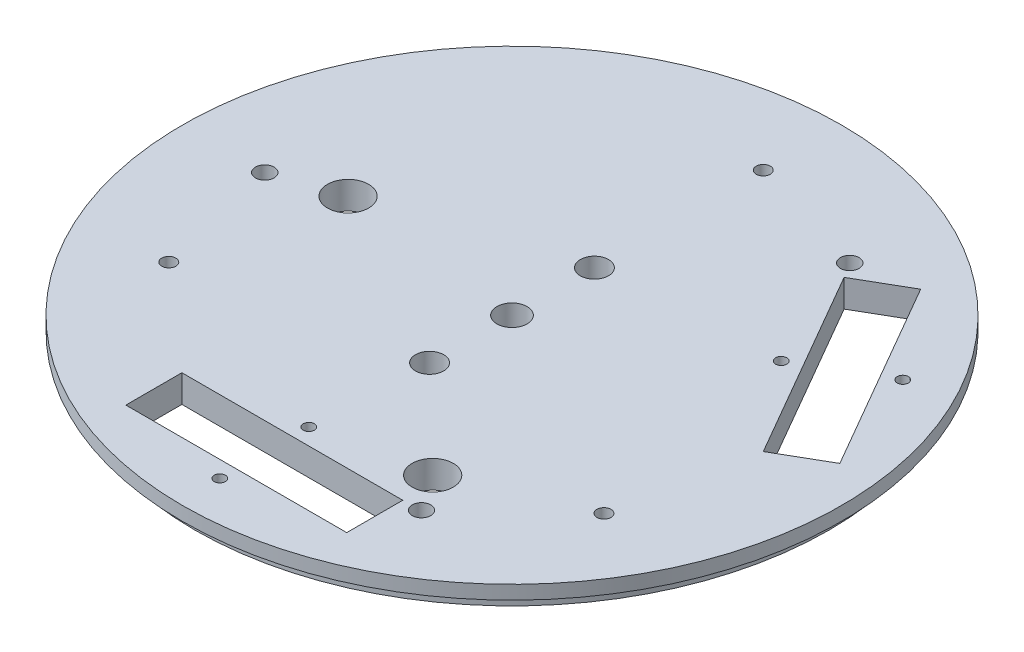
ISO-10303-21;
HEADER;
FILE_DESCRIPTION(('STEP AP214'),'2;1');
FILE_NAME('part.step','',(''),(''),'','','');
FILE_SCHEMA(('AUTOMOTIVE_DESIGN { 1 0 10303 214 1 1 1 1 }'));
ENDSEC;
DATA;
#1=APPLICATION_CONTEXT('core data for automotive mechanical design processes');
#2=APPLICATION_PROTOCOL_DEFINITION('international standard','automotive_design',2000,#1);
#3=PRODUCT_CONTEXT('',#1,'mechanical');
#4=PRODUCT('Part','Part','',(#3));
#5=PRODUCT_RELATED_PRODUCT_CATEGORY('part','',(#4));
#6=PRODUCT_DEFINITION_FORMATION('','',#4);
#7=PRODUCT_DEFINITION_CONTEXT('part definition',#1,'design');
#8=PRODUCT_DEFINITION('design','',#6,#7);
#9=PRODUCT_DEFINITION_SHAPE('','',#8);
#10=(LENGTH_UNIT() NAMED_UNIT(*) SI_UNIT(.MILLI.,.METRE.));
#11=(NAMED_UNIT(*) PLANE_ANGLE_UNIT() SI_UNIT($,.RADIAN.));
#12=(NAMED_UNIT(*) SI_UNIT($,.STERADIAN.) SOLID_ANGLE_UNIT());
#13=UNCERTAINTY_MEASURE_WITH_UNIT(LENGTH_MEASURE(1.E-05),#10,'distance_accuracy_value','');
#14=(GEOMETRIC_REPRESENTATION_CONTEXT(3) GLOBAL_UNCERTAINTY_ASSIGNED_CONTEXT((#13)) GLOBAL_UNIT_ASSIGNED_CONTEXT((#10,
#11,#12)) REPRESENTATION_CONTEXT('',''));
#15=CARTESIAN_POINT('',(0.,0.,0.));
#16=DIRECTION('',(0.,0.,1.));
#17=DIRECTION('',(1.,0.,0.));
#18=AXIS2_PLACEMENT_3D('',#15,#16,#17);
#19=CARTESIAN_POINT('',(0.,-3.175,0.));
#20=DIRECTION('',(0.,1.,0.));
#21=DIRECTION('',(0.,0.,1.));
#22=AXIS2_PLACEMENT_3D('',#19,#20,#21);
#23=CYLINDRICAL_SURFACE('',#22,76.1746);
#24=CARTESIAN_POINT('',(0.,-3.175,0.));
#25=DIRECTION('',(0.,1.,0.));
#26=DIRECTION('',(0.,0.,1.));
#27=AXIS2_PLACEMENT_3D('',#24,#25,#26);
#28=CIRCLE('',#27,76.1746);
#29=CARTESIAN_POINT('',(0.,-3.175,76.1746));
#30=VERTEX_POINT('',#29);
#31=EDGE_CURVE('E50',#30,#30,#28,.T.);
#32=ORIENTED_EDGE('',*,*,#31,.T.);
#33=EDGE_LOOP('',(#32));
#34=FACE_BOUND('',#33,.T.);
#35=CARTESIAN_POINT('',(0.,0.,0.));
#36=DIRECTION('',(0.,1.,0.));
#37=DIRECTION('',(0.,0.,1.));
#38=AXIS2_PLACEMENT_3D('',#35,#36,#37);
#39=CIRCLE('',#38,76.1746);
#40=CARTESIAN_POINT('',(0.,0.,76.1746));
#41=VERTEX_POINT('',#40);
#42=EDGE_CURVE('E262',#41,#41,#39,.T.);
#43=ORIENTED_EDGE('',*,*,#42,.F.);
#44=EDGE_LOOP('',(#43));
#45=FACE_BOUND('',#44,.T.);
#46=ADVANCED_FACE('F41',(#34,#45),#23,.T.);
#47=CARTESIAN_POINT('',(0.,-3.175,0.));
#48=DIRECTION('',(0.,1.,0.));
#49=DIRECTION('',(0.,0.,1.));
#50=AXIS2_PLACEMENT_3D('',#47,#48,#49);
#51=PLANE('',#50);
#52=CARTESIAN_POINT('',(0.,-3.175,0.));
#53=DIRECTION('',(0.,-1.,0.));
#54=DIRECTION('',(0.,0.,-1.));
#55=AXIS2_PLACEMENT_3D('',#52,#53,#54);
#56=CIRCLE('',#55,73.3171);
#57=CARTESIAN_POINT('',(0.,-3.175,-73.3171));
#58=VERTEX_POINT('',#57);
#59=EDGE_CURVE('E11',#58,#58,#56,.T.);
#60=ORIENTED_EDGE('',*,*,#59,.F.);
#61=EDGE_LOOP('',(#60));
#62=FACE_BOUND('',#61,.T.);
#63=ORIENTED_EDGE('',*,*,#31,.F.);
#64=EDGE_LOOP('',(#63));
#65=FACE_BOUND('',#64,.T.);
#66=ADVANCED_FACE('F291',(#62,#65),#51,.F.);
#67=CARTESIAN_POINT('',(0.,0.,0.));
#68=DIRECTION('',(0.,1.,0.));
#69=DIRECTION('',(0.,0.,1.));
#70=AXIS2_PLACEMENT_3D('',#67,#68,#69);
#71=PLANE('',#70);
#72=CARTESIAN_POINT('',(40.2634666873046,0.,-21.9556300087316));
#73=DIRECTION('',(0.,1.,0.));
#74=DIRECTION('',(-0.866025403784436,0.,0.500000000000004));
#75=AXIS2_PLACEMENT_3D('',#72,#73,#74);
#76=CIRCLE('',#75,1.29203120481089);
#77=CARTESIAN_POINT('',(39.1445348414561,0.,-21.3096144063262));
#78=VERTEX_POINT('',#77);
#79=EDGE_CURVE('E134',#78,#78,#76,.T.);
#80=ORIENTED_EDGE('',*,*,#79,.F.);
#81=EDGE_LOOP('',(#80));
#82=FACE_BOUND('',#81,.T.);
#83=CARTESIAN_POINT('',(58.081073344766,0.,-32.2426300087309));
#84=DIRECTION('',(0.,1.,0.));
#85=DIRECTION('',(0.866025403784436,0.,-0.500000000000004));
#86=AXIS2_PLACEMENT_3D('',#83,#84,#85);
#87=CIRCLE('',#86,1.2920312048119);
#88=CARTESIAN_POINT('',(59.2000051906153,0.,-32.8886456111368));
#89=VERTEX_POINT('',#88);
#90=EDGE_CURVE('E398',#89,#89,#87,.T.);
#91=ORIENTED_EDGE('',*,*,#90,.F.);
#92=EDGE_LOOP('',(#91));
#93=FACE_BOUND('',#92,.T.);
#94=DIRECTION('',(0.866025403784433,0.,-0.50000000000001));
#95=VECTOR('',#94,1.);
#96=CARTESIAN_POINT('',(56.326523475724,0.,-1.75359952632551));
#97=LINE('',#96,#95);
#98=CARTESIAN_POINT('',(56.326523475724,0.,-1.75359952632551));
#99=VERTEX_POINT('',#98);
#100=CARTESIAN_POINT('',(67.5450165563476,0.,-8.23059952632564));
#101=VERTEX_POINT('',#100);
#102=EDGE_CURVE('E58',#99,#101,#97,.T.);
#103=ORIENTED_EDGE('',*,*,#102,.F.);
#104=DIRECTION('',(0.50000000000001,0.,0.866025403784433));
#105=VECTOR('',#104,1.);
#106=CARTESIAN_POINT('',(56.326523475724,0.,-1.75359952632551));
#107=LINE('',#106,#105);
#108=CARTESIAN_POINT('',(30.7995234757235,0.,-45.9676604911359));
#109=VERTEX_POINT('',#108);
#110=EDGE_CURVE('E127',#109,#99,#107,.T.);
#111=ORIENTED_EDGE('',*,*,#110,.F.);
#112=DIRECTION('',(-0.866025403784433,0.,0.50000000000001));
#113=VECTOR('',#112,1.);
#114=CARTESIAN_POINT('',(30.7995234757235,0.,-45.9676604911359));
#115=LINE('',#114,#113);
#116=CARTESIAN_POINT('',(42.0180165563471,0.,-52.4446604911361));
#117=VERTEX_POINT('',#116);
#118=EDGE_CURVE('E131',#117,#109,#115,.T.);
#119=ORIENTED_EDGE('',*,*,#118,.F.);
#120=DIRECTION('',(-0.50000000000001,0.,-0.866025403784433));
#121=VECTOR('',#120,1.);
#122=CARTESIAN_POINT('',(67.5450165563476,0.,-8.23059952632564));
#123=LINE('',#122,#121);
#124=EDGE_CURVE('E141',#101,#117,#123,.T.);
#125=ORIENTED_EDGE('',*,*,#124,.F.);
#126=EDGE_LOOP('',(#103,#111,#119,#125));
#127=FACE_BOUND('',#126,.T.);
#128=CARTESIAN_POINT('',(50.2940442736039,0.,29.0372799999995));
#129=DIRECTION('',(0.,1.,0.));
#130=DIRECTION('',(0.,0.,1.));
#131=AXIS2_PLACEMENT_3D('',#128,#129,#130);
#132=CIRCLE('',#131,1.63195);
#133=CARTESIAN_POINT('',(50.2940442736039,0.,30.6692299999995));
#134=VERTEX_POINT('',#133);
#135=EDGE_CURVE('E149',#134,#134,#132,.T.);
#136=ORIENTED_EDGE('',*,*,#135,.F.);
#137=EDGE_LOOP('',(#136));
#138=FACE_BOUND('',#137,.T.);
#139=CARTESIAN_POINT('',(-50.2940442736035,0.,29.0372800000003));
#140=DIRECTION('',(0.,1.,0.));
#141=DIRECTION('',(0.,0.,1.));
#142=AXIS2_PLACEMENT_3D('',#139,#140,#141);
#143=CIRCLE('',#142,1.63195);
#144=CARTESIAN_POINT('',(-50.2940442736035,0.,30.6692300000003));
#145=VERTEX_POINT('',#144);
#146=EDGE_CURVE('E158',#145,#145,#143,.T.);
#147=ORIENTED_EDGE('',*,*,#146,.F.);
#148=EDGE_LOOP('',(#147));
#149=FACE_BOUND('',#148,.T.);
#150=CARTESIAN_POINT('',(0.,0.,-58.07456));
#151=DIRECTION('',(0.,1.,0.));
#152=DIRECTION('',(0.,0.,1.));
#153=AXIS2_PLACEMENT_3D('',#150,#151,#152);
#154=CIRCLE('',#153,1.63195);
#155=CARTESIAN_POINT('',(0.,0.,-56.44261));
#156=VERTEX_POINT('',#155);
#157=EDGE_CURVE('E164',#156,#156,#154,.T.);
#158=ORIENTED_EDGE('',*,*,#157,.F.);
#159=EDGE_LOOP('',(#158));
#160=FACE_BOUND('',#159,.T.);
#161=CARTESIAN_POINT('',(-42.7800008,0.,-4.89000038));
#162=DIRECTION('',(0.,1.,0.));
#163=DIRECTION('',(0.,0.,1.));
#164=AXIS2_PLACEMENT_3D('',#161,#162,#163);
#165=CIRCLE('',#164,4.7625);
#166=CARTESIAN_POINT('',(-42.7800008,0.,-0.127500379999995));
#167=VERTEX_POINT('',#166);
#168=EDGE_CURVE('E171',#167,#167,#165,.T.);
#169=ORIENTED_EDGE('',*,*,#168,.F.);
#170=EDGE_LOOP('',(#169));
#171=FACE_BOUND('',#170,.T.);
#172=CARTESIAN_POINT('',(22.86,0.,41.1899989));
#173=DIRECTION('',(0.,1.,0.));
#174=DIRECTION('',(0.,0.,1.));
#175=AXIS2_PLACEMENT_3D('',#172,#173,#174);
#176=CIRCLE('',#175,4.7625);
#177=CARTESIAN_POINT('',(22.86,0.,45.9524989));
#178=VERTEX_POINT('',#177);
#179=EDGE_CURVE('E170',#178,#178,#176,.T.);
#180=ORIENTED_EDGE('',*,*,#179,.F.);
#181=EDGE_LOOP('',(#180));
#182=FACE_BOUND('',#181,.T.);
#183=CARTESIAN_POINT('',(28.5749999999999,0.,49.4933518262807));
#184=DIRECTION('',(0.,1.,0.));
#185=DIRECTION('',(0.,0.,1.));
#186=AXIS2_PLACEMENT_3D('',#183,#184,#185);
#187=CIRCLE('',#186,2.159);
#188=CARTESIAN_POINT('',(28.5749999999999,0.,51.6523518262807));
#189=VERTEX_POINT('',#188);
#190=EDGE_CURVE('E192',#189,#189,#187,.T.);
#191=ORIENTED_EDGE('',*,*,#190,.F.);
#192=EDGE_LOOP('',(#191));
#193=FACE_BOUND('',#192,.T.);
#194=CARTESIAN_POINT('',(-57.15,0.,-3.78169717762944E-13));
#195=DIRECTION('',(0.,1.,0.));
#196=DIRECTION('',(0.,0.,1.));
#197=AXIS2_PLACEMENT_3D('',#194,#195,#196);
#198=CIRCLE('',#197,2.159);
#199=CARTESIAN_POINT('',(-57.15,0.,2.15899999999962));
#200=VERTEX_POINT('',#199);
#201=EDGE_CURVE('E187',#200,#200,#198,.T.);
#202=ORIENTED_EDGE('',*,*,#201,.F.);
#203=EDGE_LOOP('',(#202));
#204=FACE_BOUND('',#203,.T.);
#205=CARTESIAN_POINT('',(28.5749999999999,0.,-49.4933518262808));
#206=DIRECTION('',(0.,1.,0.));
#207=DIRECTION('',(0.,0.,1.));
#208=AXIS2_PLACEMENT_3D('',#205,#206,#207);
#209=CIRCLE('',#208,2.159);
#210=CARTESIAN_POINT('',(28.5749999999999,0.,-47.3343518262808));
#211=VERTEX_POINT('',#210);
#212=EDGE_CURVE('E199',#211,#211,#209,.T.);
#213=ORIENTED_EDGE('',*,*,#212,.F.);
#214=EDGE_LOOP('',(#213));
#215=FACE_BOUND('',#214,.T.);
#216=CARTESIAN_POINT('',(-1.11759999999898,0.,45.847));
#217=DIRECTION('',(0.,1.,0.));
#218=DIRECTION('',(0.,0.,-1.));
#219=AXIS2_PLACEMENT_3D('',#216,#217,#218);
#220=CIRCLE('',#219,1.29203120481089);
#221=CARTESIAN_POINT('',(-1.11759999999898,0.,44.5549687951891));
#222=VERTEX_POINT('',#221);
#223=EDGE_CURVE('E202',#222,#222,#220,.T.);
#224=ORIENTED_EDGE('',*,*,#223,.F.);
#225=EDGE_LOOP('',(#224));
#226=FACE_BOUND('',#225,.T.);
#227=CARTESIAN_POINT('',(-1.11759999999988,0.,66.421));
#228=DIRECTION('',(0.,1.,0.));
#229=DIRECTION('',(0.,0.,1.));
#230=AXIS2_PLACEMENT_3D('',#227,#228,#229);
#231=CIRCLE('',#230,1.2920312048119);
#232=CARTESIAN_POINT('',(-1.11759999999988,0.,67.7130312048119));
#233=VERTEX_POINT('',#232);
#234=EDGE_CURVE('E207',#233,#233,#231,.T.);
#235=ORIENTED_EDGE('',*,*,#234,.F.);
#236=EDGE_LOOP('',(#235));
#237=FACE_BOUND('',#236,.T.);
#238=DIRECTION('',(0.,0.,1.));
#239=VECTOR('',#238,1.);
#240=CARTESIAN_POINT('',(-26.6446,0.,49.6570000000002));
#241=LINE('',#240,#239);
#242=CARTESIAN_POINT('',(-26.6446,0.,49.6570000000002));
#243=VERTEX_POINT('',#242);
#244=CARTESIAN_POINT('',(-26.6445999999999,0.,62.6110000000002));
#245=VERTEX_POINT('',#244);
#246=EDGE_CURVE('E206',#243,#245,#241,.T.);
#247=ORIENTED_EDGE('',*,*,#246,.F.);
#248=DIRECTION('',(-1.,0.,0.));
#249=VECTOR('',#248,1.);
#250=CARTESIAN_POINT('',(-26.6446,0.,49.6570000000002));
#251=LINE('',#250,#249);
#252=CARTESIAN_POINT('',(24.4094,0.,49.6569999999998));
#253=VERTEX_POINT('',#252);
#254=EDGE_CURVE('E219',#253,#243,#251,.T.);
#255=ORIENTED_EDGE('',*,*,#254,.F.);
#256=DIRECTION('',(0.,0.,-1.));
#257=VECTOR('',#256,1.);
#258=CARTESIAN_POINT('',(24.4094,0.,49.6569999999998));
#259=LINE('',#258,#257);
#260=CARTESIAN_POINT('',(24.4094000000001,0.,62.6109999999998));
#261=VERTEX_POINT('',#260);
#262=EDGE_CURVE('E233',#261,#253,#259,.T.);
#263=ORIENTED_EDGE('',*,*,#262,.F.);
#264=DIRECTION('',(1.,0.,0.));
#265=VECTOR('',#264,1.);
#266=CARTESIAN_POINT('',(-26.6445999999999,0.,62.6110000000002));
#267=LINE('',#266,#265);
#268=EDGE_CURVE('E230',#245,#261,#267,.T.);
#269=ORIENTED_EDGE('',*,*,#268,.F.);
#270=EDGE_LOOP('',(#247,#255,#263,#269));
#271=FACE_BOUND('',#270,.T.);
#272=CARTESIAN_POINT('',(0.,0.,19.05));
#273=DIRECTION('',(0.,1.,0.));
#274=DIRECTION('',(0.,0.,1.));
#275=AXIS2_PLACEMENT_3D('',#272,#273,#274);
#276=CIRCLE('',#275,3.2639);
#277=CARTESIAN_POINT('',(0.,0.,22.3139));
#278=VERTEX_POINT('',#277);
#279=EDGE_CURVE('E240',#278,#278,#276,.T.);
#280=ORIENTED_EDGE('',*,*,#279,.F.);
#281=EDGE_LOOP('',(#280));
#282=FACE_BOUND('',#281,.T.);
#283=CARTESIAN_POINT('',(0.,0.,-19.05));
#284=DIRECTION('',(0.,1.,0.));
#285=DIRECTION('',(0.,0.,1.));
#286=AXIS2_PLACEMENT_3D('',#283,#284,#285);
#287=CIRCLE('',#286,3.2639);
#288=CARTESIAN_POINT('',(0.,0.,-15.7861));
#289=VERTEX_POINT('',#288);
#290=EDGE_CURVE('E249',#289,#289,#287,.T.);
#291=ORIENTED_EDGE('',*,*,#290,.F.);
#292=EDGE_LOOP('',(#291));
#293=FACE_BOUND('',#292,.T.);
#294=CARTESIAN_POINT('',(0.,0.,0.));
#295=DIRECTION('',(0.,1.,0.));
#296=DIRECTION('',(0.,0.,1.));
#297=AXIS2_PLACEMENT_3D('',#294,#295,#296);
#298=CIRCLE('',#297,3.4925);
#299=CARTESIAN_POINT('',(0.,0.,3.4925));
#300=VERTEX_POINT('',#299);
#301=EDGE_CURVE('E256',#300,#300,#298,.T.);
#302=ORIENTED_EDGE('',*,*,#301,.F.);
#303=EDGE_LOOP('',(#302));
#304=FACE_BOUND('',#303,.T.);
#305=ORIENTED_EDGE('',*,*,#42,.T.);
#306=EDGE_LOOP('',(#305));
#307=FACE_BOUND('',#306,.T.);
#308=ADVANCED_FACE('F287',(#82,#93,#127,#138,#149,#160,#171,#182,#193,#204,#215,#226,#237,#271,
#282,#293,#304,#307),#71,.T.);
#309=CARTESIAN_POINT('',(0.,-6.35,0.));
#310=DIRECTION('',(0.,1.,0.));
#311=DIRECTION('',(0.,0.,1.));
#312=AXIS2_PLACEMENT_3D('',#309,#310,#311);
#313=CYLINDRICAL_SURFACE('',#312,73.3171);
#314=CARTESIAN_POINT('',(0.,-6.35,0.));
#315=DIRECTION('',(0.,-1.,0.));
#316=DIRECTION('',(0.,0.,-1.));
#317=AXIS2_PLACEMENT_3D('',#314,#315,#316);
#318=CIRCLE('',#317,73.3171);
#319=CARTESIAN_POINT('',(0.,-6.35,-73.3171));
#320=VERTEX_POINT('',#319);
#321=EDGE_CURVE('E259',#320,#320,#318,.T.);
#322=ORIENTED_EDGE('',*,*,#321,.F.);
#323=EDGE_LOOP('',(#322));
#324=FACE_BOUND('',#323,.T.);
#325=ORIENTED_EDGE('',*,*,#59,.T.);
#326=EDGE_LOOP('',(#325));
#327=FACE_BOUND('',#326,.T.);
#328=ADVANCED_FACE('F278',(#324,#327),#313,.T.);
#329=CARTESIAN_POINT('',(0.,-6.35,0.));
#330=DIRECTION('',(0.,-1.,0.));
#331=DIRECTION('',(0.,0.,-1.));
#332=AXIS2_PLACEMENT_3D('',#329,#330,#331);
#333=PLANE('',#332);
#334=CARTESIAN_POINT('',(40.2634666873046,-6.35,-21.9556300087316));
#335=DIRECTION('',(0.,1.,0.));
#336=DIRECTION('',(-0.866025403784436,0.,0.500000000000004));
#337=AXIS2_PLACEMENT_3D('',#334,#335,#336);
#338=CIRCLE('',#337,1.29203120481089);
#339=CARTESIAN_POINT('',(39.1445348414561,-6.35,-21.3096144063262));
#340=VERTEX_POINT('',#339);
#341=EDGE_CURVE('E400',#340,#340,#338,.T.);
#342=ORIENTED_EDGE('',*,*,#341,.T.);
#343=EDGE_LOOP('',(#342));
#344=FACE_BOUND('',#343,.T.);
#345=CARTESIAN_POINT('',(58.081073344766,-6.35,-32.2426300087309));
#346=DIRECTION('',(0.,1.,0.));
#347=DIRECTION('',(0.866025403784436,0.,-0.500000000000004));
#348=AXIS2_PLACEMENT_3D('',#345,#346,#347);
#349=CIRCLE('',#348,1.2920312048119);
#350=CARTESIAN_POINT('',(59.2000051906153,-6.35,-32.8886456111368));
#351=VERTEX_POINT('',#350);
#352=EDGE_CURVE('E142',#351,#351,#349,.T.);
#353=ORIENTED_EDGE('',*,*,#352,.T.);
#354=EDGE_LOOP('',(#353));
#355=FACE_BOUND('',#354,.T.);
#356=DIRECTION('',(0.866025403784433,0.,-0.50000000000001));
#357=VECTOR('',#356,1.);
#358=CARTESIAN_POINT('',(56.326523475724,-6.35,-1.75359952632551));
#359=LINE('',#358,#357);
#360=CARTESIAN_POINT('',(56.326523475724,-6.35,-1.75359952632551));
#361=VERTEX_POINT('',#360);
#362=CARTESIAN_POINT('',(67.5450165563476,-6.35,-8.23059952632564));
#363=VERTEX_POINT('',#362);
#364=EDGE_CURVE('E110',#361,#363,#359,.T.);
#365=ORIENTED_EDGE('',*,*,#364,.T.);
#366=DIRECTION('',(-0.50000000000001,0.,-0.866025403784433));
#367=VECTOR('',#366,1.);
#368=CARTESIAN_POINT('',(67.5450165563476,-6.35,-8.23059952632564));
#369=LINE('',#368,#367);
#370=CARTESIAN_POINT('',(42.0180165563471,-6.35,-52.4446604911361));
#371=VERTEX_POINT('',#370);
#372=EDGE_CURVE('E119',#363,#371,#369,.T.);
#373=ORIENTED_EDGE('',*,*,#372,.T.);
#374=DIRECTION('',(-0.866025403784433,0.,0.50000000000001));
#375=VECTOR('',#374,1.);
#376=CARTESIAN_POINT('',(30.7995234757235,-6.35,-45.9676604911359));
#377=LINE('',#376,#375);
#378=CARTESIAN_POINT('',(30.7995234757235,-6.35,-45.9676604911359));
#379=VERTEX_POINT('',#378);
#380=EDGE_CURVE('E66',#371,#379,#377,.T.);
#381=ORIENTED_EDGE('',*,*,#380,.T.);
#382=DIRECTION('',(0.50000000000001,0.,0.866025403784433));
#383=VECTOR('',#382,1.);
#384=CARTESIAN_POINT('',(56.326523475724,-6.35,-1.75359952632551));
#385=LINE('',#384,#383);
#386=EDGE_CURVE('E116',#379,#361,#385,.T.);
#387=ORIENTED_EDGE('',*,*,#386,.T.);
#388=EDGE_LOOP('',(#365,#373,#381,#387));
#389=FACE_BOUND('',#388,.T.);
#390=CARTESIAN_POINT('',(50.2940442736039,-6.35,29.0372799999995));
#391=DIRECTION('',(0.,1.,0.));
#392=DIRECTION('',(0.,0.,1.));
#393=AXIS2_PLACEMENT_3D('',#390,#391,#392);
#394=CIRCLE('',#393,1.63195);
#395=CARTESIAN_POINT('',(50.2940442736039,-6.35,30.6692299999995));
#396=VERTEX_POINT('',#395);
#397=EDGE_CURVE('E155',#396,#396,#394,.T.);
#398=ORIENTED_EDGE('',*,*,#397,.T.);
#399=EDGE_LOOP('',(#398));
#400=FACE_BOUND('',#399,.T.);
#401=CARTESIAN_POINT('',(-50.2940442736035,-6.35,29.0372800000003));
#402=DIRECTION('',(0.,1.,0.));
#403=DIRECTION('',(0.,0.,1.));
#404=AXIS2_PLACEMENT_3D('',#401,#402,#403);
#405=CIRCLE('',#404,1.63195);
#406=CARTESIAN_POINT('',(-50.2940442736035,-6.35,30.6692300000003));
#407=VERTEX_POINT('',#406);
#408=EDGE_CURVE('E161',#407,#407,#405,.T.);
#409=ORIENTED_EDGE('',*,*,#408,.T.);
#410=EDGE_LOOP('',(#409));
#411=FACE_BOUND('',#410,.T.);
#412=CARTESIAN_POINT('',(0.,-6.35,-58.07456));
#413=DIRECTION('',(0.,1.,0.));
#414=DIRECTION('',(0.,0.,1.));
#415=AXIS2_PLACEMENT_3D('',#412,#413,#414);
#416=CIRCLE('',#415,1.63195);
#417=CARTESIAN_POINT('',(0.,-6.35,-56.44261));
#418=VERTEX_POINT('',#417);
#419=EDGE_CURVE('E167',#418,#418,#416,.T.);
#420=ORIENTED_EDGE('',*,*,#419,.T.);
#421=EDGE_LOOP('',(#420));
#422=FACE_BOUND('',#421,.T.);
#423=CARTESIAN_POINT('',(-42.7800008,-6.35,-4.89000038));
#424=DIRECTION('',(0.,-1.,0.));
#425=DIRECTION('',(0.,0.,-1.));
#426=AXIS2_PLACEMENT_3D('',#423,#424,#425);
#427=CIRCLE('',#426,4.7625);
#428=CARTESIAN_POINT('',(-42.7800008,-6.35,-9.65250038));
#429=VERTEX_POINT('',#428);
#430=EDGE_CURVE('E174',#429,#429,#427,.F.);
#431=ORIENTED_EDGE('',*,*,#430,.T.);
#432=EDGE_LOOP('',(#431));
#433=FACE_BOUND('',#432,.T.);
#434=CARTESIAN_POINT('',(22.86,-6.35,41.1899989));
#435=DIRECTION('',(0.,-1.,0.));
#436=DIRECTION('',(0.,0.,-1.));
#437=AXIS2_PLACEMENT_3D('',#434,#435,#436);
#438=CIRCLE('',#437,4.7625);
#439=CARTESIAN_POINT('',(22.86,-6.35,36.4274989));
#440=VERTEX_POINT('',#439);
#441=EDGE_CURVE('E175',#440,#440,#438,.F.);
#442=ORIENTED_EDGE('',*,*,#441,.T.);
#443=EDGE_LOOP('',(#442));
#444=FACE_BOUND('',#443,.T.);
#445=CARTESIAN_POINT('',(28.5749999999999,-6.35,49.4933518262807));
#446=DIRECTION('',(0.,1.,0.));
#447=DIRECTION('',(-0.866025403784436,0.,-0.500000000000004));
#448=AXIS2_PLACEMENT_3D('',#445,#446,#447);
#449=CIRCLE('',#448,2.159);
#450=CARTESIAN_POINT('',(26.7052511532293,-6.35,48.4138518262807));
#451=VERTEX_POINT('',#450);
#452=EDGE_CURVE('E183',#451,#451,#449,.T.);
#453=ORIENTED_EDGE('',*,*,#452,.T.);
#454=EDGE_LOOP('',(#453));
#455=FACE_BOUND('',#454,.T.);
#456=CARTESIAN_POINT('',(-57.15,-6.35,-3.78169717762944E-13));
#457=DIRECTION('',(0.,1.,0.));
#458=DIRECTION('',(0.866025403784443,0.,-0.499999999999992));
#459=AXIS2_PLACEMENT_3D('',#456,#457,#458);
#460=CIRCLE('',#459,2.159);
#461=CARTESIAN_POINT('',(-55.2802511532294,-6.35,-1.07950000000036));
#462=VERTEX_POINT('',#461);
#463=EDGE_CURVE('E178',#462,#462,#460,.T.);
#464=ORIENTED_EDGE('',*,*,#463,.T.);
#465=EDGE_LOOP('',(#464));
#466=FACE_BOUND('',#465,.T.);
#467=CARTESIAN_POINT('',(28.5749999999999,-6.35,-49.4933518262808));
#468=DIRECTION('',(0.,1.,0.));
#469=DIRECTION('',(0.,0.,1.));
#470=AXIS2_PLACEMENT_3D('',#467,#468,#469);
#471=CIRCLE('',#470,2.159);
#472=CARTESIAN_POINT('',(28.5749999999999,-6.35,-47.3343518262808));
#473=VERTEX_POINT('',#472);
#474=EDGE_CURVE('E196',#473,#473,#471,.T.);
#475=ORIENTED_EDGE('',*,*,#474,.T.);
#476=EDGE_LOOP('',(#475));
#477=FACE_BOUND('',#476,.T.);
#478=CARTESIAN_POINT('',(-1.11759999999898,-6.35,45.847));
#479=DIRECTION('',(0.,1.,0.));
#480=DIRECTION('',(0.,0.,-1.));
#481=AXIS2_PLACEMENT_3D('',#478,#479,#480);
#482=CIRCLE('',#481,1.29203120481089);
#483=CARTESIAN_POINT('',(-1.11759999999898,-6.35,44.5549687951891));
#484=VERTEX_POINT('',#483);
#485=EDGE_CURVE('E210',#484,#484,#482,.T.);
#486=ORIENTED_EDGE('',*,*,#485,.T.);
#487=EDGE_LOOP('',(#486));
#488=FACE_BOUND('',#487,.T.);
#489=CARTESIAN_POINT('',(-1.11759999999988,-6.35,66.421));
#490=DIRECTION('',(0.,1.,0.));
#491=DIRECTION('',(0.,0.,1.));
#492=AXIS2_PLACEMENT_3D('',#489,#490,#491);
#493=CIRCLE('',#492,1.2920312048119);
#494=CARTESIAN_POINT('',(-1.11759999999988,-6.35,67.7130312048119));
#495=VERTEX_POINT('',#494);
#496=EDGE_CURVE('E203',#495,#495,#493,.T.);
#497=ORIENTED_EDGE('',*,*,#496,.T.);
#498=EDGE_LOOP('',(#497));
#499=FACE_BOUND('',#498,.T.);
#500=DIRECTION('',(0.,0.,1.));
#501=VECTOR('',#500,1.);
#502=CARTESIAN_POINT('',(-26.6446,-6.35,49.6570000000002));
#503=LINE('',#502,#501);
#504=CARTESIAN_POINT('',(-26.6446,-6.35,49.6570000000002));
#505=VERTEX_POINT('',#504);
#506=CARTESIAN_POINT('',(-26.6445999999999,-6.35,62.6110000000002));
#507=VERTEX_POINT('',#506);
#508=EDGE_CURVE('E215',#505,#507,#503,.T.);
#509=ORIENTED_EDGE('',*,*,#508,.T.);
#510=DIRECTION('',(1.,0.,0.));
#511=VECTOR('',#510,1.);
#512=CARTESIAN_POINT('',(-26.6445999999999,-6.35,62.6110000000002));
#513=LINE('',#512,#511);
#514=CARTESIAN_POINT('',(24.4094000000001,-6.35,62.6109999999998));
#515=VERTEX_POINT('',#514);
#516=EDGE_CURVE('E218',#507,#515,#513,.T.);
#517=ORIENTED_EDGE('',*,*,#516,.T.);
#518=DIRECTION('',(0.,0.,-1.));
#519=VECTOR('',#518,1.);
#520=CARTESIAN_POINT('',(24.4094,-6.35,49.6569999999998));
#521=LINE('',#520,#519);
#522=CARTESIAN_POINT('',(24.4094,-6.35,49.6569999999998));
#523=VERTEX_POINT('',#522);
#524=EDGE_CURVE('E222',#515,#523,#521,.T.);
#525=ORIENTED_EDGE('',*,*,#524,.T.);
#526=DIRECTION('',(-1.,0.,0.));
#527=VECTOR('',#526,1.);
#528=CARTESIAN_POINT('',(-26.6446,-6.35,49.6570000000002));
#529=LINE('',#528,#527);
#530=EDGE_CURVE('E225',#523,#505,#529,.T.);
#531=ORIENTED_EDGE('',*,*,#530,.T.);
#532=EDGE_LOOP('',(#509,#517,#525,#531));
#533=FACE_BOUND('',#532,.T.);
#534=CARTESIAN_POINT('',(0.,-6.35,19.05));
#535=DIRECTION('',(0.,-1.,0.));
#536=DIRECTION('',(0.,0.,-1.));
#537=AXIS2_PLACEMENT_3D('',#534,#535,#536);
#538=CIRCLE('',#537,3.2639);
#539=CARTESIAN_POINT('',(0.,-6.35,15.7861));
#540=VERTEX_POINT('',#539);
#541=EDGE_CURVE('E44',#540,#540,#538,.T.);
#542=ORIENTED_EDGE('',*,*,#541,.F.);
#543=EDGE_LOOP('',(#542));
#544=FACE_BOUND('',#543,.T.);
#545=CARTESIAN_POINT('',(0.,-6.35,-19.05));
#546=DIRECTION('',(0.,-1.,0.));
#547=DIRECTION('',(0.,0.,-1.));
#548=AXIS2_PLACEMENT_3D('',#545,#546,#547);
#549=CIRCLE('',#548,3.2639);
#550=CARTESIAN_POINT('',(0.,-6.35,-22.3139));
#551=VERTEX_POINT('',#550);
#552=EDGE_CURVE('E252',#551,#551,#549,.T.);
#553=ORIENTED_EDGE('',*,*,#552,.F.);
#554=EDGE_LOOP('',(#553));
#555=FACE_BOUND('',#554,.T.);
#556=CARTESIAN_POINT('',(0.,-6.35,0.));
#557=DIRECTION('',(0.,-1.,0.));
#558=DIRECTION('',(0.,0.,-1.));
#559=AXIS2_PLACEMENT_3D('',#556,#557,#558);
#560=CIRCLE('',#559,3.4925);
#561=CARTESIAN_POINT('',(0.,-6.35,-3.4925));
#562=VERTEX_POINT('',#561);
#563=EDGE_CURVE('E253',#562,#562,#560,.T.);
#564=ORIENTED_EDGE('',*,*,#563,.F.);
#565=EDGE_LOOP('',(#564));
#566=FACE_BOUND('',#565,.T.);
#567=ORIENTED_EDGE('',*,*,#321,.T.);
#568=EDGE_LOOP('',(#567));
#569=FACE_BOUND('',#568,.T.);
#570=ADVANCED_FACE('F124',(#344,#355,#389,#400,#411,#422,#433,#444,#455,#466,#477,#488,#499,
#533,#544,#555,#566,#569),#333,.T.);
#571=CARTESIAN_POINT('',(0.,-6.35,0.));
#572=DIRECTION('',(0.,-1.,0.));
#573=DIRECTION('',(0.,0.,-1.));
#574=AXIS2_PLACEMENT_3D('',#571,#572,#573);
#575=CYLINDRICAL_SURFACE('',#574,3.4925);
#576=ORIENTED_EDGE('',*,*,#301,.T.);
#577=EDGE_LOOP('',(#576));
#578=FACE_BOUND('',#577,.T.);
#579=ORIENTED_EDGE('',*,*,#563,.T.);
#580=EDGE_LOOP('',(#579));
#581=FACE_BOUND('',#580,.T.);
#582=ADVANCED_FACE('F277',(#578,#581),#575,.F.);
#583=CARTESIAN_POINT('',(0.,0.,-19.05));
#584=DIRECTION('',(0.,1.,0.));
#585=DIRECTION('',(0.,0.,1.));
#586=AXIS2_PLACEMENT_3D('',#583,#584,#585);
#587=CYLINDRICAL_SURFACE('',#586,3.2639);
#588=ORIENTED_EDGE('',*,*,#552,.T.);
#589=EDGE_LOOP('',(#588));
#590=FACE_BOUND('',#589,.T.);
#591=ORIENTED_EDGE('',*,*,#290,.T.);
#592=EDGE_LOOP('',(#591));
#593=FACE_BOUND('',#592,.T.);
#594=ADVANCED_FACE('F272',(#590,#593),#587,.F.);
#595=CARTESIAN_POINT('',(0.,0.,19.05));
#596=DIRECTION('',(0.,1.,0.));
#597=DIRECTION('',(0.,0.,1.));
#598=AXIS2_PLACEMENT_3D('',#595,#596,#597);
#599=CYLINDRICAL_SURFACE('',#598,3.2639);
#600=ORIENTED_EDGE('',*,*,#541,.T.);
#601=EDGE_LOOP('',(#600));
#602=FACE_BOUND('',#601,.T.);
#603=ORIENTED_EDGE('',*,*,#279,.T.);
#604=EDGE_LOOP('',(#603));
#605=FACE_BOUND('',#604,.T.);
#606=ADVANCED_FACE('F313',(#602,#605),#599,.F.);
#607=CARTESIAN_POINT('',(-26.6446,-6.35,49.6570000000002));
#608=DIRECTION('',(-1.,0.,0.));
#609=DIRECTION('',(0.,0.,1.));
#610=AXIS2_PLACEMENT_3D('',#607,#608,#609);
#611=PLANE('',#610);
#612=ORIENTED_EDGE('',*,*,#246,.T.);
#613=DIRECTION('',(0.,1.,0.));
#614=VECTOR('',#613,1.);
#615=CARTESIAN_POINT('',(-26.6445999999999,-6.35,62.6110000000002));
#616=LINE('',#615,#614);
#617=EDGE_CURVE('E228',#507,#245,#616,.T.);
#618=ORIENTED_EDGE('',*,*,#617,.F.);
#619=ORIENTED_EDGE('',*,*,#508,.F.);
#620=DIRECTION('',(0.,1.,0.));
#621=VECTOR('',#620,1.);
#622=CARTESIAN_POINT('',(-26.6446,-6.35,49.6570000000002));
#623=LINE('',#622,#621);
#624=EDGE_CURVE('E238',#505,#243,#623,.T.);
#625=ORIENTED_EDGE('',*,*,#624,.T.);
#626=EDGE_LOOP('',(#612,#618,#619,#625));
#627=FACE_BOUND('',#626,.T.);
#628=ADVANCED_FACE('F316',(#627),#611,.F.);
#629=CARTESIAN_POINT('',(-26.6446,-6.35,49.6570000000002));
#630=DIRECTION('',(0.,0.,-1.));
#631=DIRECTION('',(-1.,0.,0.));
#632=AXIS2_PLACEMENT_3D('',#629,#630,#631);
#633=PLANE('',#632);
#634=ORIENTED_EDGE('',*,*,#254,.T.);
#635=ORIENTED_EDGE('',*,*,#624,.F.);
#636=ORIENTED_EDGE('',*,*,#530,.F.);
#637=DIRECTION('',(0.,1.,0.));
#638=VECTOR('',#637,1.);
#639=CARTESIAN_POINT('',(24.4094,-6.35,49.6569999999998));
#640=LINE('',#639,#638);
#641=EDGE_CURVE('E241',#523,#253,#640,.T.);
#642=ORIENTED_EDGE('',*,*,#641,.T.);
#643=EDGE_LOOP('',(#634,#635,#636,#642));
#644=FACE_BOUND('',#643,.T.);
#645=ADVANCED_FACE('F320',(#644),#633,.F.);
#646=CARTESIAN_POINT('',(24.4094,-6.35,49.6569999999998));
#647=DIRECTION('',(1.,0.,0.));
#648=DIRECTION('',(0.,0.,-1.));
#649=AXIS2_PLACEMENT_3D('',#646,#647,#648);
#650=PLANE('',#649);
#651=ORIENTED_EDGE('',*,*,#262,.T.);
#652=ORIENTED_EDGE('',*,*,#641,.F.);
#653=ORIENTED_EDGE('',*,*,#524,.F.);
#654=DIRECTION('',(0.,1.,0.));
#655=VECTOR('',#654,1.);
#656=CARTESIAN_POINT('',(24.4094000000001,-6.35,62.6109999999998));
#657=LINE('',#656,#655);
#658=EDGE_CURVE('E243',#515,#261,#657,.T.);
#659=ORIENTED_EDGE('',*,*,#658,.T.);
#660=EDGE_LOOP('',(#651,#652,#653,#659));
#661=FACE_BOUND('',#660,.T.);
#662=ADVANCED_FACE('F326',(#661),#650,.F.);
#663=CARTESIAN_POINT('',(-26.6445999999999,-6.35,62.6110000000002));
#664=DIRECTION('',(0.,0.,1.));
#665=DIRECTION('',(1.,0.,0.));
#666=AXIS2_PLACEMENT_3D('',#663,#664,#665);
#667=PLANE('',#666);
#668=ORIENTED_EDGE('',*,*,#268,.T.);
#669=ORIENTED_EDGE('',*,*,#658,.F.);
#670=ORIENTED_EDGE('',*,*,#516,.F.);
#671=ORIENTED_EDGE('',*,*,#617,.T.);
#672=EDGE_LOOP('',(#668,#669,#670,#671));
#673=FACE_BOUND('',#672,.T.);
#674=ADVANCED_FACE('F322',(#673),#667,.F.);
#675=CARTESIAN_POINT('',(-1.11759999999988,-6.35,66.421));
#676=DIRECTION('',(0.,1.,0.));
#677=DIRECTION('',(0.,0.,1.));
#678=AXIS2_PLACEMENT_3D('',#675,#676,#677);
#679=CYLINDRICAL_SURFACE('',#678,1.2920312048119);
#680=ORIENTED_EDGE('',*,*,#496,.F.);
#681=EDGE_LOOP('',(#680));
#682=FACE_BOUND('',#681,.T.);
#683=ORIENTED_EDGE('',*,*,#234,.T.);
#684=EDGE_LOOP('',(#683));
#685=FACE_BOUND('',#684,.T.);
#686=ADVANCED_FACE('F325',(#682,#685),#679,.F.);
#687=CARTESIAN_POINT('',(-1.11759999999898,-6.35,45.847));
#688=DIRECTION('',(0.,1.,0.));
#689=DIRECTION('',(0.,0.,1.));
#690=AXIS2_PLACEMENT_3D('',#687,#688,#689);
#691=CYLINDRICAL_SURFACE('',#690,1.29203120481089);
#692=ORIENTED_EDGE('',*,*,#485,.F.);
#693=EDGE_LOOP('',(#692));
#694=FACE_BOUND('',#693,.T.);
#695=ORIENTED_EDGE('',*,*,#223,.T.);
#696=EDGE_LOOP('',(#695));
#697=FACE_BOUND('',#696,.T.);
#698=ADVANCED_FACE('F334',(#694,#697),#691,.F.);
#699=CARTESIAN_POINT('',(28.5749999999999,-6.35,-49.4933518262808));
#700=DIRECTION('',(0.,1.,0.));
#701=DIRECTION('',(0.,0.,1.));
#702=AXIS2_PLACEMENT_3D('',#699,#700,#701);
#703=CYLINDRICAL_SURFACE('',#702,2.159);
#704=ORIENTED_EDGE('',*,*,#212,.T.);
#705=EDGE_LOOP('',(#704));
#706=FACE_BOUND('',#705,.T.);
#707=ORIENTED_EDGE('',*,*,#474,.F.);
#708=EDGE_LOOP('',(#707));
#709=FACE_BOUND('',#708,.T.);
#710=ADVANCED_FACE('F337',(#706,#709),#703,.F.);
#711=CARTESIAN_POINT('',(-57.15,-6.35,-3.78169717762944E-13));
#712=DIRECTION('',(0.,1.,0.));
#713=DIRECTION('',(0.,0.,1.));
#714=AXIS2_PLACEMENT_3D('',#711,#712,#713);
#715=CYLINDRICAL_SURFACE('',#714,2.159);
#716=ORIENTED_EDGE('',*,*,#201,.T.);
#717=EDGE_LOOP('',(#716));
#718=FACE_BOUND('',#717,.T.);
#719=ORIENTED_EDGE('',*,*,#463,.F.);
#720=EDGE_LOOP('',(#719));
#721=FACE_BOUND('',#720,.T.);
#722=ADVANCED_FACE('F344',(#718,#721),#715,.F.);
#723=CARTESIAN_POINT('',(28.5749999999999,-6.35,49.4933518262807));
#724=DIRECTION('',(0.,1.,0.));
#725=DIRECTION('',(0.,0.,1.));
#726=AXIS2_PLACEMENT_3D('',#723,#724,#725);
#727=CYLINDRICAL_SURFACE('',#726,2.159);
#728=ORIENTED_EDGE('',*,*,#190,.T.);
#729=EDGE_LOOP('',(#728));
#730=FACE_BOUND('',#729,.T.);
#731=ORIENTED_EDGE('',*,*,#452,.F.);
#732=EDGE_LOOP('',(#731));
#733=FACE_BOUND('',#732,.T.);
#734=ADVANCED_FACE('F348',(#730,#733),#727,.F.);
#735=CARTESIAN_POINT('',(22.86,-19.8203841816037,41.1899989));
#736=DIRECTION('',(0.,1.,0.));
#737=DIRECTION('',(0.,0.,1.));
#738=AXIS2_PLACEMENT_3D('',#735,#736,#737);
#739=CYLINDRICAL_SURFACE('',#738,4.7625);
#740=ORIENTED_EDGE('',*,*,#179,.T.);
#741=EDGE_LOOP('',(#740));
#742=FACE_BOUND('',#741,.T.);
#743=ORIENTED_EDGE('',*,*,#441,.F.);
#744=EDGE_LOOP('',(#743));
#745=FACE_BOUND('',#744,.T.);
#746=ADVANCED_FACE('F352',(#742,#745),#739,.F.);
#747=CARTESIAN_POINT('',(-42.7800008,-19.8203841816037,-4.89000038));
#748=DIRECTION('',(0.,1.,0.));
#749=DIRECTION('',(0.,0.,1.));
#750=AXIS2_PLACEMENT_3D('',#747,#748,#749);
#751=CYLINDRICAL_SURFACE('',#750,4.7625);
#752=ORIENTED_EDGE('',*,*,#168,.T.);
#753=EDGE_LOOP('',(#752));
#754=FACE_BOUND('',#753,.T.);
#755=ORIENTED_EDGE('',*,*,#430,.F.);
#756=EDGE_LOOP('',(#755));
#757=FACE_BOUND('',#756,.T.);
#758=ADVANCED_FACE('F356',(#754,#757),#751,.F.);
#759=CARTESIAN_POINT('',(0.,0.,-58.07456));
#760=DIRECTION('',(0.,1.,0.));
#761=DIRECTION('',(0.,0.,1.));
#762=AXIS2_PLACEMENT_3D('',#759,#760,#761);
#763=CYLINDRICAL_SURFACE('',#762,1.63195);
#764=ORIENTED_EDGE('',*,*,#419,.F.);
#765=EDGE_LOOP('',(#764));
#766=FACE_BOUND('',#765,.T.);
#767=ORIENTED_EDGE('',*,*,#157,.T.);
#768=EDGE_LOOP('',(#767));
#769=FACE_BOUND('',#768,.T.);
#770=ADVANCED_FACE('F360',(#766,#769),#763,.F.);
#771=CARTESIAN_POINT('',(-50.2940442736035,0.,29.0372800000003));
#772=DIRECTION('',(0.,1.,0.));
#773=DIRECTION('',(0.,0.,1.));
#774=AXIS2_PLACEMENT_3D('',#771,#772,#773);
#775=CYLINDRICAL_SURFACE('',#774,1.63195);
#776=ORIENTED_EDGE('',*,*,#408,.F.);
#777=EDGE_LOOP('',(#776));
#778=FACE_BOUND('',#777,.T.);
#779=ORIENTED_EDGE('',*,*,#146,.T.);
#780=EDGE_LOOP('',(#779));
#781=FACE_BOUND('',#780,.T.);
#782=ADVANCED_FACE('F364',(#778,#781),#775,.F.);
#783=CARTESIAN_POINT('',(50.2940442736039,0.,29.0372799999995));
#784=DIRECTION('',(0.,1.,0.));
#785=DIRECTION('',(0.,0.,1.));
#786=AXIS2_PLACEMENT_3D('',#783,#784,#785);
#787=CYLINDRICAL_SURFACE('',#786,1.63195);
#788=ORIENTED_EDGE('',*,*,#397,.F.);
#789=EDGE_LOOP('',(#788));
#790=FACE_BOUND('',#789,.T.);
#791=ORIENTED_EDGE('',*,*,#135,.T.);
#792=EDGE_LOOP('',(#791));
#793=FACE_BOUND('',#792,.T.);
#794=ADVANCED_FACE('F368',(#790,#793),#787,.F.);
#795=CARTESIAN_POINT('',(56.326523475724,-6.35,-1.75359952632551));
#796=DIRECTION('',(0.50000000000001,0.,0.866025403784433));
#797=DIRECTION('',(0.866025403784433,0.,-0.50000000000001));
#798=AXIS2_PLACEMENT_3D('',#795,#796,#797);
#799=PLANE('',#798);
#800=ORIENTED_EDGE('',*,*,#102,.T.);
#801=DIRECTION('',(0.,1.,0.));
#802=VECTOR('',#801,1.);
#803=CARTESIAN_POINT('',(67.5450165563476,-6.35,-8.23059952632564));
#804=LINE('',#803,#802);
#805=EDGE_CURVE('E106',#363,#101,#804,.T.);
#806=ORIENTED_EDGE('',*,*,#805,.F.);
#807=ORIENTED_EDGE('',*,*,#364,.F.);
#808=DIRECTION('',(0.,1.,0.));
#809=VECTOR('',#808,1.);
#810=CARTESIAN_POINT('',(56.326523475724,-6.35,-1.75359952632551));
#811=LINE('',#810,#809);
#812=EDGE_CURVE('E147',#361,#99,#811,.T.);
#813=ORIENTED_EDGE('',*,*,#812,.T.);
#814=EDGE_LOOP('',(#800,#806,#807,#813));
#815=FACE_BOUND('',#814,.T.);
#816=ADVANCED_FACE('F108',(#815),#799,.F.);
#817=CARTESIAN_POINT('',(56.326523475724,-6.35,-1.75359952632551));
#818=DIRECTION('',(-0.866025403784433,0.,0.50000000000001));
#819=DIRECTION('',(0.50000000000001,0.,0.866025403784433));
#820=AXIS2_PLACEMENT_3D('',#817,#818,#819);
#821=PLANE('',#820);
#822=ORIENTED_EDGE('',*,*,#110,.T.);
#823=ORIENTED_EDGE('',*,*,#812,.F.);
#824=ORIENTED_EDGE('',*,*,#386,.F.);
#825=DIRECTION('',(0.,1.,0.));
#826=VECTOR('',#825,1.);
#827=CARTESIAN_POINT('',(30.7995234757235,-6.35,-45.9676604911359));
#828=LINE('',#827,#826);
#829=EDGE_CURVE('E150',#379,#109,#828,.T.);
#830=ORIENTED_EDGE('',*,*,#829,.T.);
#831=EDGE_LOOP('',(#822,#823,#824,#830));
#832=FACE_BOUND('',#831,.T.);
#833=ADVANCED_FACE('F375',(#832),#821,.F.);
#834=CARTESIAN_POINT('',(30.7995234757235,-6.35,-45.9676604911359));
#835=DIRECTION('',(-0.50000000000001,0.,-0.866025403784433));
#836=DIRECTION('',(-0.866025403784433,0.,0.50000000000001));
#837=AXIS2_PLACEMENT_3D('',#834,#835,#836);
#838=PLANE('',#837);
#839=ORIENTED_EDGE('',*,*,#118,.T.);
#840=ORIENTED_EDGE('',*,*,#829,.F.);
#841=ORIENTED_EDGE('',*,*,#380,.F.);
#842=DIRECTION('',(0.,1.,0.));
#843=VECTOR('',#842,1.);
#844=CARTESIAN_POINT('',(42.0180165563471,-6.35,-52.4446604911361));
#845=LINE('',#844,#843);
#846=EDGE_CURVE('E115',#371,#117,#845,.T.);
#847=ORIENTED_EDGE('',*,*,#846,.T.);
#848=EDGE_LOOP('',(#839,#840,#841,#847));
#849=FACE_BOUND('',#848,.T.);
#850=ADVANCED_FACE('F379',(#849),#838,.F.);
#851=CARTESIAN_POINT('',(67.5450165563476,-6.35,-8.23059952632564));
#852=DIRECTION('',(0.866025403784433,0.,-0.50000000000001));
#853=DIRECTION('',(-0.50000000000001,0.,-0.866025403784433));
#854=AXIS2_PLACEMENT_3D('',#851,#852,#853);
#855=PLANE('',#854);
#856=ORIENTED_EDGE('',*,*,#124,.T.);
#857=ORIENTED_EDGE('',*,*,#846,.F.);
#858=ORIENTED_EDGE('',*,*,#372,.F.);
#859=ORIENTED_EDGE('',*,*,#805,.T.);
#860=EDGE_LOOP('',(#856,#857,#858,#859));
#861=FACE_BOUND('',#860,.T.);
#862=ADVANCED_FACE('F120',(#861),#855,.F.);
#863=CARTESIAN_POINT('',(58.081073344766,-6.35,-32.2426300087309));
#864=DIRECTION('',(0.,1.,0.));
#865=DIRECTION('',(0.,0.,1.));
#866=AXIS2_PLACEMENT_3D('',#863,#864,#865);
#867=CYLINDRICAL_SURFACE('',#866,1.2920312048119);
#868=ORIENTED_EDGE('',*,*,#352,.F.);
#869=EDGE_LOOP('',(#868));
#870=FACE_BOUND('',#869,.T.);
#871=ORIENTED_EDGE('',*,*,#90,.T.);
#872=EDGE_LOOP('',(#871));
#873=FACE_BOUND('',#872,.T.);
#874=ADVANCED_FACE('F378',(#870,#873),#867,.F.);
#875=CARTESIAN_POINT('',(40.2634666873046,-6.35,-21.9556300087316));
#876=DIRECTION('',(0.,1.,0.));
#877=DIRECTION('',(0.,0.,1.));
#878=AXIS2_PLACEMENT_3D('',#875,#876,#877);
#879=CYLINDRICAL_SURFACE('',#878,1.29203120481089);
#880=ORIENTED_EDGE('',*,*,#341,.F.);
#881=EDGE_LOOP('',(#880));
#882=FACE_BOUND('',#881,.T.);
#883=ORIENTED_EDGE('',*,*,#79,.T.);
#884=EDGE_LOOP('',(#883));
#885=FACE_BOUND('',#884,.T.);
#886=ADVANCED_FACE('F385',(#882,#885),#879,.F.);
#887=CLOSED_SHELL('',(#46,#66,#308,#328,#570,#582,#594,#606,#628,#645,#662,#674,#686,#698,#710,
#722,#734,#746,#758,#770,#782,#794,#816,#833,#850,#862,#874,#886));
#888=MANIFOLD_SOLID_BREP('B2',#887);
#889=ADVANCED_BREP_SHAPE_REPRESENTATION('',(#18,#888),#14);
#890=SHAPE_DEFINITION_REPRESENTATION(#9,#889);
ENDSEC;
END-ISO-10303-21;
